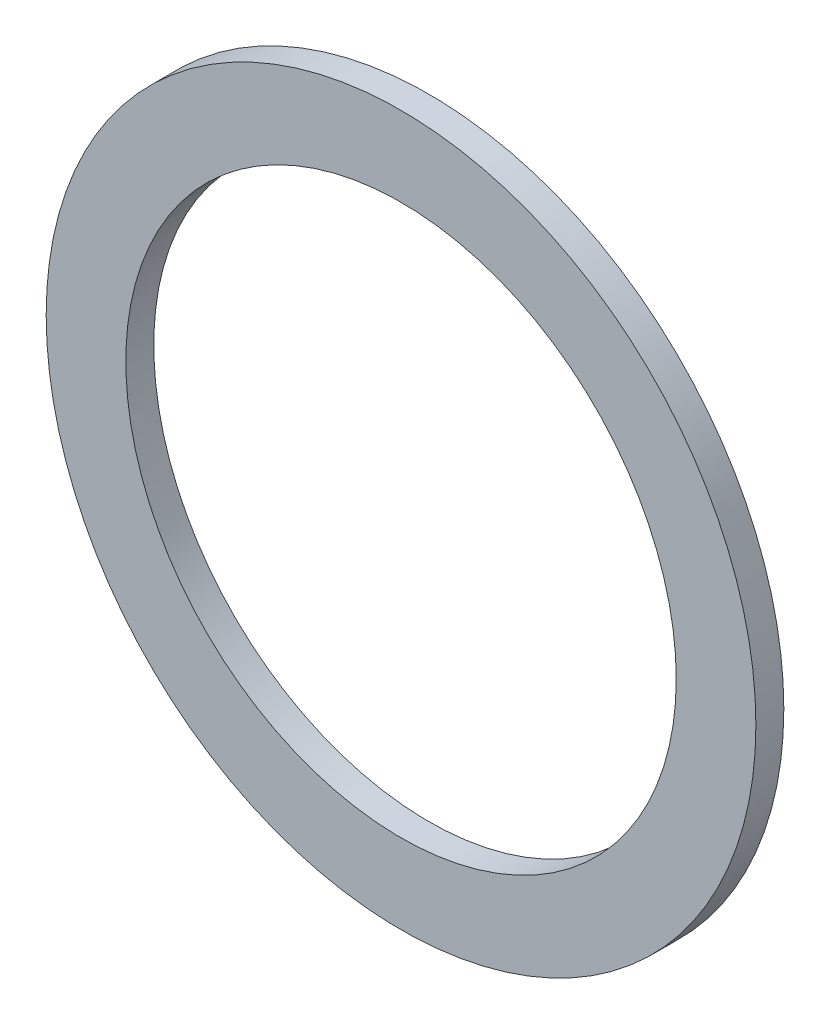
ISO-10303-21;
HEADER;
FILE_DESCRIPTION(('STEP AP214'),'2;1');
FILE_NAME('part.step','',(''),(''),'','','');
FILE_SCHEMA(('AUTOMOTIVE_DESIGN { 1 0 10303 214 1 1 1 1 }'));
ENDSEC;
DATA;
#1=APPLICATION_CONTEXT('core data for automotive mechanical design processes');
#2=APPLICATION_PROTOCOL_DEFINITION('international standard','automotive_design',2000,#1);
#3=PRODUCT_CONTEXT('',#1,'mechanical');
#4=PRODUCT('Part','Part','',(#3));
#5=PRODUCT_RELATED_PRODUCT_CATEGORY('part','',(#4));
#6=PRODUCT_DEFINITION_FORMATION('','',#4);
#7=PRODUCT_DEFINITION_CONTEXT('part definition',#1,'design');
#8=PRODUCT_DEFINITION('design','',#6,#7);
#9=PRODUCT_DEFINITION_SHAPE('','',#8);
#10=(LENGTH_UNIT() NAMED_UNIT(*) SI_UNIT(.MILLI.,.METRE.));
#11=(NAMED_UNIT(*) PLANE_ANGLE_UNIT() SI_UNIT($,.RADIAN.));
#12=(NAMED_UNIT(*) SI_UNIT($,.STERADIAN.) SOLID_ANGLE_UNIT());
#13=UNCERTAINTY_MEASURE_WITH_UNIT(LENGTH_MEASURE(1.E-05),#10,'distance_accuracy_value','');
#14=(GEOMETRIC_REPRESENTATION_CONTEXT(3) GLOBAL_UNCERTAINTY_ASSIGNED_CONTEXT((#13)) GLOBAL_UNIT_ASSIGNED_CONTEXT((#10,
#11,#12)) REPRESENTATION_CONTEXT('',''));
#15=CARTESIAN_POINT('',(0.,0.,0.));
#16=DIRECTION('',(0.,0.,1.));
#17=DIRECTION('',(1.,0.,0.));
#18=AXIS2_PLACEMENT_3D('',#15,#16,#17);
#19=CARTESIAN_POINT('',(0.,0.,5.));
#20=DIRECTION('',(0.,0.,1.));
#21=DIRECTION('',(1.,0.,0.));
#22=AXIS2_PLACEMENT_3D('',#19,#20,#21);
#23=PLANE('',#22);
#24=CARTESIAN_POINT('',(0.,0.,5.));
#25=DIRECTION('',(0.,0.,1.));
#26=DIRECTION('',(1.,0.,0.));
#27=AXIS2_PLACEMENT_3D('',#24,#25,#26);
#28=CIRCLE('',#27,63.5);
#29=CARTESIAN_POINT('',(63.5,0.,5.));
#30=VERTEX_POINT('',#29);
#31=EDGE_CURVE('E10',#30,#30,#28,.T.);
#32=ORIENTED_EDGE('',*,*,#31,.T.);
#33=EDGE_LOOP('',(#32));
#34=FACE_BOUND('',#33,.T.);
#35=CARTESIAN_POINT('',(0.,0.,5.));
#36=DIRECTION('',(0.,0.,1.));
#37=DIRECTION('',(1.,0.,0.));
#38=AXIS2_PLACEMENT_3D('',#35,#36,#37);
#39=CIRCLE('',#38,49.25);
#40=CARTESIAN_POINT('',(49.25,0.,5.));
#41=VERTEX_POINT('',#40);
#42=EDGE_CURVE('E52',#41,#41,#39,.T.);
#43=ORIENTED_EDGE('',*,*,#42,.F.);
#44=EDGE_LOOP('',(#43));
#45=FACE_BOUND('',#44,.T.);
#46=ADVANCED_FACE('F41',(#34,#45),#23,.T.);
#47=CARTESIAN_POINT('',(0.,0.,0.));
#48=DIRECTION('',(0.,0.,1.));
#49=DIRECTION('',(1.,0.,0.));
#50=AXIS2_PLACEMENT_3D('',#47,#48,#49);
#51=PLANE('',#50);
#52=CARTESIAN_POINT('',(0.,0.,0.));
#53=DIRECTION('',(0.,0.,1.));
#54=DIRECTION('',(1.,0.,0.));
#55=AXIS2_PLACEMENT_3D('',#52,#53,#54);
#56=CIRCLE('',#55,63.5);
#57=CARTESIAN_POINT('',(63.5,0.,0.));
#58=VERTEX_POINT('',#57);
#59=EDGE_CURVE('E45',#58,#58,#56,.T.);
#60=ORIENTED_EDGE('',*,*,#59,.F.);
#61=EDGE_LOOP('',(#60));
#62=FACE_BOUND('',#61,.T.);
#63=CARTESIAN_POINT('',(0.,0.,0.));
#64=DIRECTION('',(0.,0.,1.));
#65=DIRECTION('',(1.,0.,0.));
#66=AXIS2_PLACEMENT_3D('',#63,#64,#65);
#67=CIRCLE('',#66,49.25);
#68=CARTESIAN_POINT('',(49.25,0.,0.));
#69=VERTEX_POINT('',#68);
#70=EDGE_CURVE('E54',#69,#69,#67,.T.);
#71=ORIENTED_EDGE('',*,*,#70,.T.);
#72=EDGE_LOOP('',(#71));
#73=FACE_BOUND('',#72,.T.);
#74=ADVANCED_FACE('F64',(#62,#73),#51,.F.);
#75=CARTESIAN_POINT('',(0.,0.,5.));
#76=DIRECTION('',(0.,0.,-1.));
#77=DIRECTION('',(-1.,0.,0.));
#78=AXIS2_PLACEMENT_3D('',#75,#76,#77);
#79=CYLINDRICAL_SURFACE('',#78,63.5);
#80=ORIENTED_EDGE('',*,*,#31,.F.);
#81=EDGE_LOOP('',(#80));
#82=FACE_BOUND('',#81,.T.);
#83=ORIENTED_EDGE('',*,*,#59,.T.);
#84=EDGE_LOOP('',(#83));
#85=FACE_BOUND('',#84,.T.);
#86=ADVANCED_FACE('F43',(#82,#85),#79,.T.);
#87=CARTESIAN_POINT('',(0.,0.,5.));
#88=DIRECTION('',(0.,0.,-1.));
#89=DIRECTION('',(-1.,0.,0.));
#90=AXIS2_PLACEMENT_3D('',#87,#88,#89);
#91=CYLINDRICAL_SURFACE('',#90,49.25);
#92=ORIENTED_EDGE('',*,*,#42,.T.);
#93=EDGE_LOOP('',(#92));
#94=FACE_BOUND('',#93,.T.);
#95=ORIENTED_EDGE('',*,*,#70,.F.);
#96=EDGE_LOOP('',(#95));
#97=FACE_BOUND('',#96,.T.);
#98=ADVANCED_FACE('F60',(#94,#97),#91,.F.);
#99=CLOSED_SHELL('',(#46,#74,#86,#98));
#100=MANIFOLD_SOLID_BREP('B2',#99);
#101=ADVANCED_BREP_SHAPE_REPRESENTATION('',(#18,#100),#14);
#102=SHAPE_DEFINITION_REPRESENTATION(#9,#101);
ENDSEC;
END-ISO-10303-21;
